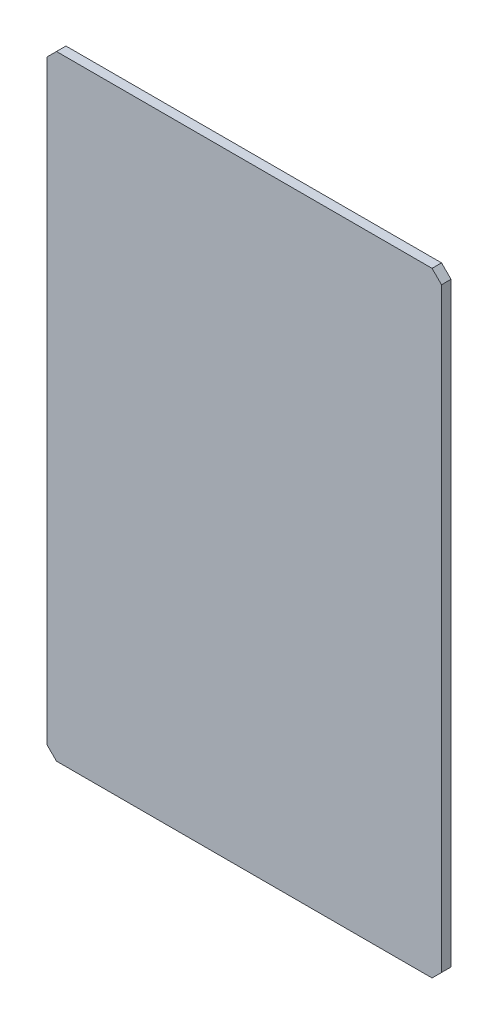
ISO-10303-21;
HEADER;
FILE_DESCRIPTION(('STEP AP214'),'2;1');
FILE_NAME('part.step','',(''),(''),'','','');
FILE_SCHEMA(('AUTOMOTIVE_DESIGN { 1 0 10303 214 1 1 1 1 }'));
ENDSEC;
DATA;
#1=APPLICATION_CONTEXT('core data for automotive mechanical design processes');
#2=APPLICATION_PROTOCOL_DEFINITION('international standard','automotive_design',2000,#1);
#3=PRODUCT_CONTEXT('',#1,'mechanical');
#4=PRODUCT('Part','Part','',(#3));
#5=PRODUCT_RELATED_PRODUCT_CATEGORY('part','',(#4));
#6=PRODUCT_DEFINITION_FORMATION('','',#4);
#7=PRODUCT_DEFINITION_CONTEXT('part definition',#1,'design');
#8=PRODUCT_DEFINITION('design','',#6,#7);
#9=PRODUCT_DEFINITION_SHAPE('','',#8);
#10=(LENGTH_UNIT() NAMED_UNIT(*) SI_UNIT(.MILLI.,.METRE.));
#11=(NAMED_UNIT(*) PLANE_ANGLE_UNIT() SI_UNIT($,.RADIAN.));
#12=(NAMED_UNIT(*) SI_UNIT($,.STERADIAN.) SOLID_ANGLE_UNIT());
#13=UNCERTAINTY_MEASURE_WITH_UNIT(LENGTH_MEASURE(1.E-05),#10,'distance_accuracy_value','');
#14=(GEOMETRIC_REPRESENTATION_CONTEXT(3) GLOBAL_UNCERTAINTY_ASSIGNED_CONTEXT((#13)) GLOBAL_UNIT_ASSIGNED_CONTEXT((#10,
#11,#12)) REPRESENTATION_CONTEXT('',''));
#15=CARTESIAN_POINT('',(0.,0.,0.));
#16=DIRECTION('',(0.,0.,1.));
#17=DIRECTION('',(1.,0.,0.));
#18=AXIS2_PLACEMENT_3D('',#15,#16,#17);
#19=CARTESIAN_POINT('',(-80.5,25.,5.));
#20=DIRECTION('',(1.,0.,0.));
#21=DIRECTION('',(0.,1.,0.));
#22=AXIS2_PLACEMENT_3D('',#19,#20,#21);
#23=PLANE('',#22);
#24=DIRECTION('',(0.,-1.,0.));
#25=VECTOR('',#24,1.);
#26=CARTESIAN_POINT('',(-80.5,25.,5.));
#27=LINE('',#26,#25);
#28=CARTESIAN_POINT('',(-80.5,20.,5.));
#29=VERTEX_POINT('',#28);
#30=CARTESIAN_POINT('',(-80.5,-294.,5.));
#31=VERTEX_POINT('',#30);
#32=EDGE_CURVE('E119',#29,#31,#27,.T.);
#33=ORIENTED_EDGE('',*,*,#32,.F.);
#34=DIRECTION('',(0.,0.,-1.));
#35=VECTOR('',#34,1.);
#36=CARTESIAN_POINT('',(-80.5,20.,5.));
#37=LINE('',#36,#35);
#38=CARTESIAN_POINT('',(-80.5,20.,0.));
#39=VERTEX_POINT('',#38);
#40=EDGE_CURVE('E104',#29,#39,#37,.T.);
#41=ORIENTED_EDGE('',*,*,#40,.T.);
#42=DIRECTION('',(0.,-1.,0.));
#43=VECTOR('',#42,1.);
#44=CARTESIAN_POINT('',(-80.5,25.,0.));
#45=LINE('',#44,#43);
#46=CARTESIAN_POINT('',(-80.5,-294.,0.));
#47=VERTEX_POINT('',#46);
#48=EDGE_CURVE('E116',#39,#47,#45,.T.);
#49=ORIENTED_EDGE('',*,*,#48,.T.);
#50=DIRECTION('',(0.,0.,1.));
#51=VECTOR('',#50,1.);
#52=CARTESIAN_POINT('',(-80.5,-294.,5.));
#53=LINE('',#52,#51);
#54=EDGE_CURVE('E121',#47,#31,#53,.T.);
#55=ORIENTED_EDGE('',*,*,#54,.T.);
#56=EDGE_LOOP('',(#33,#41,#49,#55));
#57=FACE_BOUND('',#56,.T.);
#58=ADVANCED_FACE('F33',(#57),#23,.F.);
#59=CARTESIAN_POINT('',(-80.5,-299.,5.));
#60=DIRECTION('',(0.,1.,0.));
#61=DIRECTION('',(0.,0.,1.));
#62=AXIS2_PLACEMENT_3D('',#59,#60,#61);
#63=PLANE('',#62);
#64=DIRECTION('',(1.,0.,0.));
#65=VECTOR('',#64,1.);
#66=CARTESIAN_POINT('',(-80.5,-299.,5.));
#67=LINE('',#66,#65);
#68=CARTESIAN_POINT('',(-75.4999999999999,-299.,5.));
#69=VERTEX_POINT('',#68);
#70=CARTESIAN_POINT('',(122.5,-299.,5.));
#71=VERTEX_POINT('',#70);
#72=EDGE_CURVE('E159',#69,#71,#67,.T.);
#73=ORIENTED_EDGE('',*,*,#72,.F.);
#74=DIRECTION('',(0.,0.,-1.));
#75=VECTOR('',#74,1.);
#76=CARTESIAN_POINT('',(-75.4999999999999,-299.,5.));
#77=LINE('',#76,#75);
#78=CARTESIAN_POINT('',(-75.4999999999999,-299.,0.));
#79=VERTEX_POINT('',#78);
#80=EDGE_CURVE('E11',#69,#79,#77,.T.);
#81=ORIENTED_EDGE('',*,*,#80,.T.);
#82=DIRECTION('',(1.,0.,0.));
#83=VECTOR('',#82,1.);
#84=CARTESIAN_POINT('',(-80.5,-299.,0.));
#85=LINE('',#84,#83);
#86=CARTESIAN_POINT('',(122.5,-299.,0.));
#87=VERTEX_POINT('',#86);
#88=EDGE_CURVE('E126',#79,#87,#85,.T.);
#89=ORIENTED_EDGE('',*,*,#88,.T.);
#90=DIRECTION('',(0.,0.,1.));
#91=VECTOR('',#90,1.);
#92=CARTESIAN_POINT('',(122.5,-299.,5.));
#93=LINE('',#92,#91);
#94=EDGE_CURVE('E41',#87,#71,#93,.T.);
#95=ORIENTED_EDGE('',*,*,#94,.T.);
#96=EDGE_LOOP('',(#73,#81,#89,#95));
#97=FACE_BOUND('',#96,.T.);
#98=ADVANCED_FACE('F158',(#97),#63,.F.);
#99=CARTESIAN_POINT('',(127.5,25.,5.));
#100=DIRECTION('',(-1.,0.,0.));
#101=DIRECTION('',(0.,-1.,0.));
#102=AXIS2_PLACEMENT_3D('',#99,#100,#101);
#103=PLANE('',#102);
#104=DIRECTION('',(0.,1.,0.));
#105=VECTOR('',#104,1.);
#106=CARTESIAN_POINT('',(127.5,25.,0.));
#107=LINE('',#106,#105);
#108=CARTESIAN_POINT('',(127.5,-294.,0.));
#109=VERTEX_POINT('',#108);
#110=CARTESIAN_POINT('',(127.5,20.,0.));
#111=VERTEX_POINT('',#110);
#112=EDGE_CURVE('E129',#109,#111,#107,.T.);
#113=ORIENTED_EDGE('',*,*,#112,.T.);
#114=DIRECTION('',(0.,0.,1.));
#115=VECTOR('',#114,1.);
#116=CARTESIAN_POINT('',(127.5,20.,5.));
#117=LINE('',#116,#115);
#118=CARTESIAN_POINT('',(127.5,20.,5.));
#119=VERTEX_POINT('',#118);
#120=EDGE_CURVE('E48',#111,#119,#117,.T.);
#121=ORIENTED_EDGE('',*,*,#120,.T.);
#122=DIRECTION('',(0.,1.,0.));
#123=VECTOR('',#122,1.);
#124=CARTESIAN_POINT('',(127.5,25.,5.));
#125=LINE('',#124,#123);
#126=CARTESIAN_POINT('',(127.5,-294.,5.));
#127=VERTEX_POINT('',#126);
#128=EDGE_CURVE('E165',#127,#119,#125,.T.);
#129=ORIENTED_EDGE('',*,*,#128,.F.);
#130=DIRECTION('',(0.,0.,-1.));
#131=VECTOR('',#130,1.);
#132=CARTESIAN_POINT('',(127.5,-294.,5.));
#133=LINE('',#132,#131);
#134=EDGE_CURVE('E152',#127,#109,#133,.T.);
#135=ORIENTED_EDGE('',*,*,#134,.T.);
#136=EDGE_LOOP('',(#113,#121,#129,#135));
#137=FACE_BOUND('',#136,.T.);
#138=ADVANCED_FACE('F169',(#137),#103,.F.);
#139=CARTESIAN_POINT('',(-80.5,25.,5.));
#140=DIRECTION('',(0.,-1.,0.));
#141=DIRECTION('',(0.,0.,-1.));
#142=AXIS2_PLACEMENT_3D('',#139,#140,#141);
#143=PLANE('',#142);
#144=DIRECTION('',(-1.,0.,0.));
#145=VECTOR('',#144,1.);
#146=CARTESIAN_POINT('',(-80.5,25.,0.));
#147=LINE('',#146,#145);
#148=CARTESIAN_POINT('',(122.5,25.,0.));
#149=VERTEX_POINT('',#148);
#150=CARTESIAN_POINT('',(-75.4999999999999,25.,0.));
#151=VERTEX_POINT('',#150);
#152=EDGE_CURVE('E136',#149,#151,#147,.T.);
#153=ORIENTED_EDGE('',*,*,#152,.T.);
#154=DIRECTION('',(0.,0.,1.));
#155=VECTOR('',#154,1.);
#156=CARTESIAN_POINT('',(-75.4999999999999,25.,5.));
#157=LINE('',#156,#155);
#158=CARTESIAN_POINT('',(-75.4999999999999,25.,5.));
#159=VERTEX_POINT('',#158);
#160=EDGE_CURVE('E105',#151,#159,#157,.T.);
#161=ORIENTED_EDGE('',*,*,#160,.T.);
#162=DIRECTION('',(-1.,0.,0.));
#163=VECTOR('',#162,1.);
#164=CARTESIAN_POINT('',(-80.5,25.,5.));
#165=LINE('',#164,#163);
#166=CARTESIAN_POINT('',(122.5,25.,5.));
#167=VERTEX_POINT('',#166);
#168=EDGE_CURVE('E132',#167,#159,#165,.T.);
#169=ORIENTED_EDGE('',*,*,#168,.F.);
#170=DIRECTION('',(0.,0.,-1.));
#171=VECTOR('',#170,1.);
#172=CARTESIAN_POINT('',(122.5,25.,5.));
#173=LINE('',#172,#171);
#174=EDGE_CURVE('E110',#167,#149,#173,.T.);
#175=ORIENTED_EDGE('',*,*,#174,.T.);
#176=EDGE_LOOP('',(#153,#161,#169,#175));
#177=FACE_BOUND('',#176,.T.);
#178=ADVANCED_FACE('F176',(#177),#143,.F.);
#179=CARTESIAN_POINT('',(0.,0.,5.));
#180=DIRECTION('',(0.,0.,1.));
#181=DIRECTION('',(1.,0.,0.));
#182=AXIS2_PLACEMENT_3D('',#179,#180,#181);
#183=PLANE('',#182);
#184=ORIENTED_EDGE('',*,*,#168,.T.);
#185=DIRECTION('',(0.707106781186551,0.707106781186544,0.));
#186=VECTOR('',#185,1.);
#187=CARTESIAN_POINT('',(-50.2499999999996,50.2500000000001,5.));
#188=LINE('',#187,#186);
#189=EDGE_CURVE('E150',#159,#29,#188,.F.);
#190=ORIENTED_EDGE('',*,*,#189,.T.);
#191=ORIENTED_EDGE('',*,*,#32,.T.);
#192=DIRECTION('',(-0.707106781186548,0.707106781186548,0.));
#193=VECTOR('',#192,1.);
#194=CARTESIAN_POINT('',(-187.25,-187.25,5.));
#195=LINE('',#194,#193);
#196=EDGE_CURVE('E146',#31,#69,#195,.F.);
#197=ORIENTED_EDGE('',*,*,#196,.T.);
#198=ORIENTED_EDGE('',*,*,#72,.T.);
#199=DIRECTION('',(-0.707106781186544,-0.707106781186551,0.));
#200=VECTOR('',#199,1.);
#201=CARTESIAN_POINT('',(210.750000000001,-210.749999999998,5.));
#202=LINE('',#201,#200);
#203=EDGE_CURVE('E55',#71,#127,#202,.F.);
#204=ORIENTED_EDGE('',*,*,#203,.T.);
#205=ORIENTED_EDGE('',*,*,#128,.T.);
#206=DIRECTION('',(0.707106781186543,-0.707106781186552,0.));
#207=VECTOR('',#206,1.);
#208=CARTESIAN_POINT('',(73.7500000000009,73.7499999999998,5.));
#209=LINE('',#208,#207);
#210=EDGE_CURVE('E148',#119,#167,#209,.F.);
#211=ORIENTED_EDGE('',*,*,#210,.T.);
#212=EDGE_LOOP('',(#184,#190,#191,#197,#198,#204,#205,#211));
#213=FACE_BOUND('',#212,.T.);
#214=ADVANCED_FACE('F163',(#213),#183,.T.);
#215=CARTESIAN_POINT('',(0.,0.,0.));
#216=DIRECTION('',(0.,0.,1.));
#217=DIRECTION('',(1.,0.,0.));
#218=AXIS2_PLACEMENT_3D('',#215,#216,#217);
#219=PLANE('',#218);
#220=ORIENTED_EDGE('',*,*,#48,.F.);
#221=DIRECTION('',(-0.707106781186551,-0.707106781186544,0.));
#222=VECTOR('',#221,1.);
#223=CARTESIAN_POINT('',(-80.5,20.,0.));
#224=LINE('',#223,#222);
#225=EDGE_CURVE('E100',#39,#151,#224,.F.);
#226=ORIENTED_EDGE('',*,*,#225,.T.);
#227=ORIENTED_EDGE('',*,*,#152,.F.);
#228=DIRECTION('',(-0.707106781186543,0.707106781186552,0.));
#229=VECTOR('',#228,1.);
#230=CARTESIAN_POINT('',(122.5,25.,0.));
#231=LINE('',#230,#229);
#232=EDGE_CURVE('E111',#149,#111,#231,.F.);
#233=ORIENTED_EDGE('',*,*,#232,.T.);
#234=ORIENTED_EDGE('',*,*,#112,.F.);
#235=DIRECTION('',(0.707106781186544,0.707106781186551,0.));
#236=VECTOR('',#235,1.);
#237=CARTESIAN_POINT('',(127.5,-294.,0.));
#238=LINE('',#237,#236);
#239=EDGE_CURVE('E120',#109,#87,#238,.F.);
#240=ORIENTED_EDGE('',*,*,#239,.T.);
#241=ORIENTED_EDGE('',*,*,#88,.F.);
#242=DIRECTION('',(0.707106781186548,-0.707106781186548,0.));
#243=VECTOR('',#242,1.);
#244=CARTESIAN_POINT('',(-75.4999999999999,-299.,0.));
#245=LINE('',#244,#243);
#246=EDGE_CURVE('E125',#79,#47,#245,.F.);
#247=ORIENTED_EDGE('',*,*,#246,.T.);
#248=EDGE_LOOP('',(#220,#226,#227,#233,#234,#240,#241,#247));
#249=FACE_BOUND('',#248,.T.);
#250=ADVANCED_FACE('F123',(#249),#219,.F.);
#251=CARTESIAN_POINT('',(-80.5,20.,5.));
#252=DIRECTION('',(0.707106781186543,-0.707106781186551,0.));
#253=DIRECTION('',(0.,0.,-1.));
#254=AXIS2_PLACEMENT_3D('',#251,#252,#253);
#255=PLANE('',#254);
#256=ORIENTED_EDGE('',*,*,#189,.F.);
#257=ORIENTED_EDGE('',*,*,#160,.F.);
#258=ORIENTED_EDGE('',*,*,#225,.F.);
#259=ORIENTED_EDGE('',*,*,#40,.F.);
#260=EDGE_LOOP('',(#256,#257,#258,#259));
#261=FACE_BOUND('',#260,.T.);
#262=ADVANCED_FACE('F103',(#261),#255,.F.);
#263=CARTESIAN_POINT('',(122.5,25.,5.));
#264=DIRECTION('',(-0.707106781186552,-0.707106781186542,0.));
#265=DIRECTION('',(0.,0.,-1.));
#266=AXIS2_PLACEMENT_3D('',#263,#264,#265);
#267=PLANE('',#266);
#268=ORIENTED_EDGE('',*,*,#210,.F.);
#269=ORIENTED_EDGE('',*,*,#120,.F.);
#270=ORIENTED_EDGE('',*,*,#232,.F.);
#271=ORIENTED_EDGE('',*,*,#174,.F.);
#272=EDGE_LOOP('',(#268,#269,#270,#271));
#273=FACE_BOUND('',#272,.T.);
#274=ADVANCED_FACE('F173',(#273),#267,.F.);
#275=CARTESIAN_POINT('',(-75.4999999999999,-299.,5.));
#276=DIRECTION('',(0.707106781186547,0.707106781186547,0.));
#277=DIRECTION('',(0.,0.,-1.));
#278=AXIS2_PLACEMENT_3D('',#275,#276,#277);
#279=PLANE('',#278);
#280=ORIENTED_EDGE('',*,*,#196,.F.);
#281=ORIENTED_EDGE('',*,*,#54,.F.);
#282=ORIENTED_EDGE('',*,*,#246,.F.);
#283=ORIENTED_EDGE('',*,*,#80,.F.);
#284=EDGE_LOOP('',(#280,#281,#282,#283));
#285=FACE_BOUND('',#284,.T.);
#286=ADVANCED_FACE('F179',(#285),#279,.F.);
#287=CARTESIAN_POINT('',(127.5,-294.,5.));
#288=DIRECTION('',(-0.707106781186551,0.707106781186543,0.));
#289=DIRECTION('',(0.,0.,-1.));
#290=AXIS2_PLACEMENT_3D('',#287,#288,#289);
#291=PLANE('',#290);
#292=ORIENTED_EDGE('',*,*,#203,.F.);
#293=ORIENTED_EDGE('',*,*,#94,.F.);
#294=ORIENTED_EDGE('',*,*,#239,.F.);
#295=ORIENTED_EDGE('',*,*,#134,.F.);
#296=EDGE_LOOP('',(#292,#293,#294,#295));
#297=FACE_BOUND('',#296,.T.);
#298=ADVANCED_FACE('F35',(#297),#291,.F.);
#299=CLOSED_SHELL('',(#58,#98,#138,#178,#214,#250,#262,#274,#286,#298));
#300=MANIFOLD_SOLID_BREP('B2',#299);
#301=ADVANCED_BREP_SHAPE_REPRESENTATION('',(#18,#300),#14);
#302=SHAPE_DEFINITION_REPRESENTATION(#9,#301);
ENDSEC;
END-ISO-10303-21;
